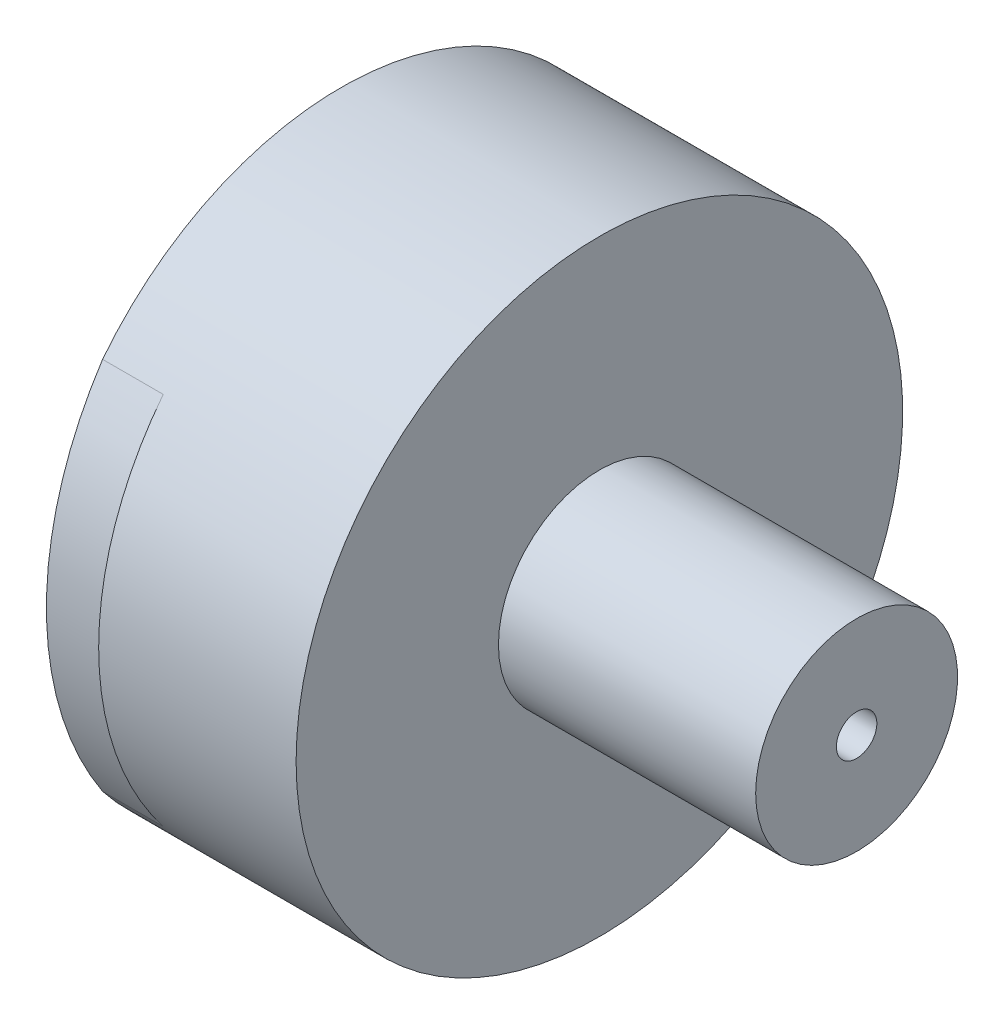
ISO-10303-21;
HEADER;
FILE_DESCRIPTION(('STEP AP214'),'2;1');
FILE_NAME('part.step','',(''),(''),'','','');
FILE_SCHEMA(('AUTOMOTIVE_DESIGN { 1 0 10303 214 1 1 1 1 }'));
ENDSEC;
DATA;
#1=APPLICATION_CONTEXT('core data for automotive mechanical design processes');
#2=APPLICATION_PROTOCOL_DEFINITION('international standard','automotive_design',2000,#1);
#3=PRODUCT_CONTEXT('',#1,'mechanical');
#4=PRODUCT('Part','Part','',(#3));
#5=PRODUCT_RELATED_PRODUCT_CATEGORY('part','',(#4));
#6=PRODUCT_DEFINITION_FORMATION('','',#4);
#7=PRODUCT_DEFINITION_CONTEXT('part definition',#1,'design');
#8=PRODUCT_DEFINITION('design','',#6,#7);
#9=PRODUCT_DEFINITION_SHAPE('','',#8);
#10=(LENGTH_UNIT() NAMED_UNIT(*) SI_UNIT(.MILLI.,.METRE.));
#11=(NAMED_UNIT(*) PLANE_ANGLE_UNIT() SI_UNIT($,.RADIAN.));
#12=(NAMED_UNIT(*) SI_UNIT($,.STERADIAN.) SOLID_ANGLE_UNIT());
#13=UNCERTAINTY_MEASURE_WITH_UNIT(LENGTH_MEASURE(1.E-05),#10,'distance_accuracy_value','');
#14=(GEOMETRIC_REPRESENTATION_CONTEXT(3) GLOBAL_UNCERTAINTY_ASSIGNED_CONTEXT((#13)) GLOBAL_UNIT_ASSIGNED_CONTEXT((#10,
#11,#12)) REPRESENTATION_CONTEXT('',''));
#15=CARTESIAN_POINT('',(0.,0.,0.));
#16=DIRECTION('',(0.,0.,1.));
#17=DIRECTION('',(1.,0.,0.));
#18=AXIS2_PLACEMENT_3D('',#15,#16,#17);
#19=CARTESIAN_POINT('',(11.5273434496704,0.,-2.00327059412866));
#20=DIRECTION('',(-1.,0.,0.));
#21=DIRECTION('',(0.,0.,1.));
#22=AXIS2_PLACEMENT_3D('',#19,#20,#21);
#23=CYLINDRICAL_SURFACE('',#22,0.249999999999999);
#24=CARTESIAN_POINT('',(11.5214103802107,0.,-2.00327059412866));
#25=DIRECTION('',(-1.,0.,0.));
#26=DIRECTION('',(0.,0.,1.));
#27=AXIS2_PLACEMENT_3D('',#24,#25,#26);
#28=CIRCLE('',#27,0.249999999999999);
#29=CARTESIAN_POINT('',(11.5214103802107,0.,-1.75327059412866));
#30=VERTEX_POINT('',#29);
#31=EDGE_CURVE('E94',#30,#30,#28,.T.);
#32=ORIENTED_EDGE('',*,*,#31,.F.);
#33=EDGE_LOOP('',(#32));
#34=FACE_BOUND('',#33,.T.);
#35=CARTESIAN_POINT('',(6.75,0.,-2.00327059412866));
#36=DIRECTION('',(-1.,0.,0.));
#37=DIRECTION('',(0.,0.,1.));
#38=AXIS2_PLACEMENT_3D('',#35,#36,#37);
#39=CIRCLE('',#38,0.249999999999999);
#40=CARTESIAN_POINT('',(6.75,0.,-1.75327059412866));
#41=VERTEX_POINT('',#40);
#42=EDGE_CURVE('E49',#41,#41,#39,.T.);
#43=ORIENTED_EDGE('',*,*,#42,.T.);
#44=EDGE_LOOP('',(#43));
#45=FACE_BOUND('',#44,.T.);
#46=ADVANCED_FACE('F45',(#34,#45),#23,.F.);
#47=CARTESIAN_POINT('',(5.15,1.5,0.));
#48=DIRECTION('',(1.,0.,0.));
#49=DIRECTION('',(0.,0.,-1.));
#50=AXIS2_PLACEMENT_3D('',#47,#48,#49);
#51=PLANE('',#50);
#52=CARTESIAN_POINT('',(5.15,0.,-2.00327059412866));
#53=DIRECTION('',(-1.,0.,0.));
#54=DIRECTION('',(0.,0.,1.));
#55=AXIS2_PLACEMENT_3D('',#52,#53,#54);
#56=CIRCLE('',#55,2.45);
#57=CARTESIAN_POINT('',(5.15,0.,0.446729405871341));
#58=VERTEX_POINT('',#57);
#59=EDGE_CURVE('E99',#58,#58,#56,.T.);
#60=ORIENTED_EDGE('',*,*,#59,.F.);
#61=EDGE_LOOP('',(#60));
#62=FACE_BOUND('',#61,.T.);
#63=CARTESIAN_POINT('',(5.15,0.,-2.00327059412866));
#64=DIRECTION('',(-1.,0.,0.));
#65=DIRECTION('',(0.,0.,1.));
#66=AXIS2_PLACEMENT_3D('',#63,#64,#65);
#67=CIRCLE('',#66,3.75);
#68=CARTESIAN_POINT('',(5.15,2.31316347355121,0.94830097786964));
#69=VERTEX_POINT('',#68);
#70=CARTESIAN_POINT('',(5.15,-2.31316347355121,0.948300977869641));
#71=VERTEX_POINT('',#70);
#72=EDGE_CURVE('E83',#69,#71,#67,.T.);
#73=ORIENTED_EDGE('',*,*,#72,.T.);
#74=CARTESIAN_POINT('',(5.15,0.,-2.55730521002783));
#75=DIRECTION('',(-1.,0.,0.));
#76=DIRECTION('',(0.,0.,-1.));
#77=AXIS2_PLACEMENT_3D('',#74,#75,#76);
#78=CIRCLE('',#77,4.19999999999959);
#79=EDGE_CURVE('E67',#71,#69,#78,.T.);
#80=ORIENTED_EDGE('',*,*,#79,.T.);
#81=EDGE_LOOP('',(#73,#80));
#82=FACE_BOUND('',#81,.T.);
#83=ADVANCED_FACE('F47',(#62,#82),#51,.F.);
#84=CARTESIAN_POINT('',(11.5273434496704,0.,-2.00327059412866));
#85=DIRECTION('',(-1.,0.,0.));
#86=DIRECTION('',(0.,0.,1.));
#87=AXIS2_PLACEMENT_3D('',#84,#85,#86);
#88=CYLINDRICAL_SURFACE('',#87,3.75);
#89=CARTESIAN_POINT('',(8.34104882918019,0.,-2.00327059412866));
#90=DIRECTION('',(-1.,0.,0.));
#91=DIRECTION('',(0.,0.,1.));
#92=AXIS2_PLACEMENT_3D('',#89,#90,#91);
#93=CIRCLE('',#92,3.75);
#94=CARTESIAN_POINT('',(8.34104882918019,0.,1.74672940587134));
#95=VERTEX_POINT('',#94);
#96=EDGE_CURVE('E77',#95,#95,#93,.T.);
#97=ORIENTED_EDGE('',*,*,#96,.T.);
#98=EDGE_LOOP('',(#97));
#99=FACE_BOUND('',#98,.T.);
#100=DIRECTION('',(-1.,0.,0.));
#101=VECTOR('',#100,1.);
#102=CARTESIAN_POINT('',(6.74552441459009,-2.31316347355121,0.94830097786964));
#103=LINE('',#102,#101);
#104=CARTESIAN_POINT('',(5.9,-2.31316347355121,0.94830097786964));
#105=VERTEX_POINT('',#104);
#106=EDGE_CURVE('E11',#71,#105,#103,.F.);
#107=ORIENTED_EDGE('',*,*,#106,.F.);
#108=ORIENTED_EDGE('',*,*,#72,.F.);
#109=DIRECTION('',(-1.,0.,0.));
#110=VECTOR('',#109,1.);
#111=CARTESIAN_POINT('',(6.74552441459009,2.31316347355121,0.94830097786964));
#112=LINE('',#111,#110);
#113=CARTESIAN_POINT('',(5.9,2.31316347355121,0.94830097786964));
#114=VERTEX_POINT('',#113);
#115=EDGE_CURVE('E54',#114,#69,#112,.T.);
#116=ORIENTED_EDGE('',*,*,#115,.F.);
#117=CARTESIAN_POINT('',(5.9,0.,-2.00327059412866));
#118=DIRECTION('',(-1.,0.,0.));
#119=DIRECTION('',(0.,0.,1.));
#120=AXIS2_PLACEMENT_3D('',#117,#118,#119);
#121=CIRCLE('',#120,3.75);
#122=EDGE_CURVE('E72',#105,#114,#121,.T.);
#123=ORIENTED_EDGE('',*,*,#122,.F.);
#124=EDGE_LOOP('',(#107,#108,#116,#123));
#125=FACE_BOUND('',#124,.T.);
#126=ADVANCED_FACE('F82',(#99,#125),#88,.T.);
#127=CARTESIAN_POINT('',(8.34104882918019,3.75,-2.00327059412866));
#128=DIRECTION('',(1.,0.,0.));
#129=DIRECTION('',(0.,0.,-1.));
#130=AXIS2_PLACEMENT_3D('',#127,#128,#129);
#131=PLANE('',#130);
#132=CARTESIAN_POINT('',(8.34104882918019,0.,-2.00327059412866));
#133=DIRECTION('',(-1.,0.,0.));
#134=DIRECTION('',(0.,0.,1.));
#135=AXIS2_PLACEMENT_3D('',#132,#133,#134);
#136=CIRCLE('',#135,1.24819439740606);
#137=CARTESIAN_POINT('',(8.34104882918019,0.,-0.755076196722596));
#138=VERTEX_POINT('',#137);
#139=EDGE_CURVE('E88',#138,#138,#136,.T.);
#140=ORIENTED_EDGE('',*,*,#139,.T.);
#141=EDGE_LOOP('',(#140));
#142=FACE_BOUND('',#141,.T.);
#143=ORIENTED_EDGE('',*,*,#96,.F.);
#144=EDGE_LOOP('',(#143));
#145=FACE_BOUND('',#144,.T.);
#146=ADVANCED_FACE('F138',(#142,#145),#131,.T.);
#147=CARTESIAN_POINT('',(11.5273434496704,0.,-2.00327059412866));
#148=DIRECTION('',(-1.,0.,0.));
#149=DIRECTION('',(0.,0.,1.));
#150=AXIS2_PLACEMENT_3D('',#147,#148,#149);
#151=CYLINDRICAL_SURFACE('',#150,1.24819439740606);
#152=CARTESIAN_POINT('',(11.5214103802107,0.,-2.00327059412866));
#153=DIRECTION('',(-1.,0.,0.));
#154=DIRECTION('',(0.,0.,1.));
#155=AXIS2_PLACEMENT_3D('',#152,#153,#154);
#156=CIRCLE('',#155,1.24819439740606);
#157=CARTESIAN_POINT('',(11.5214103802107,0.,-0.755076196722597));
#158=VERTEX_POINT('',#157);
#159=EDGE_CURVE('E91',#158,#158,#156,.T.);
#160=ORIENTED_EDGE('',*,*,#159,.T.);
#161=EDGE_LOOP('',(#160));
#162=FACE_BOUND('',#161,.T.);
#163=ORIENTED_EDGE('',*,*,#139,.F.);
#164=EDGE_LOOP('',(#163));
#165=FACE_BOUND('',#164,.T.);
#166=ADVANCED_FACE('F134',(#162,#165),#151,.T.);
#167=CARTESIAN_POINT('',(11.5214103802107,1.24819439740606,-2.00327059412866));
#168=DIRECTION('',(1.,0.,0.));
#169=DIRECTION('',(0.,0.,-1.));
#170=AXIS2_PLACEMENT_3D('',#167,#168,#169);
#171=PLANE('',#170);
#172=ORIENTED_EDGE('',*,*,#31,.T.);
#173=EDGE_LOOP('',(#172));
#174=FACE_BOUND('',#173,.T.);
#175=ORIENTED_EDGE('',*,*,#159,.F.);
#176=EDGE_LOOP('',(#175));
#177=FACE_BOUND('',#176,.T.);
#178=ADVANCED_FACE('F131',(#174,#177),#171,.T.);
#179=CARTESIAN_POINT('',(5.15,0.,-2.55730521002783));
#180=DIRECTION('',(1.,0.,0.));
#181=DIRECTION('',(0.,0.,-1.));
#182=AXIS2_PLACEMENT_3D('',#179,#180,#181);
#183=CYLINDRICAL_SURFACE('',#182,4.19999999999959);
#184=CARTESIAN_POINT('',(5.9,0.,-2.55730521002783));
#185=DIRECTION('',(-1.,0.,0.));
#186=DIRECTION('',(0.,0.,-1.));
#187=AXIS2_PLACEMENT_3D('',#184,#185,#186);
#188=CIRCLE('',#187,4.19999999999959);
#189=EDGE_CURVE('E60',#105,#114,#188,.T.);
#190=ORIENTED_EDGE('',*,*,#189,.T.);
#191=ORIENTED_EDGE('',*,*,#115,.T.);
#192=ORIENTED_EDGE('',*,*,#79,.F.);
#193=ORIENTED_EDGE('',*,*,#106,.T.);
#194=EDGE_LOOP('',(#190,#191,#192,#193));
#195=FACE_BOUND('',#194,.T.);
#196=ADVANCED_FACE('F79',(#195),#183,.T.);
#197=CARTESIAN_POINT('',(5.9,0.,-1.27865260501392));
#198=DIRECTION('',(1.,0.,0.));
#199=DIRECTION('',(0.,0.,-1.));
#200=AXIS2_PLACEMENT_3D('',#197,#198,#199);
#201=PLANE('',#200);
#202=ORIENTED_EDGE('',*,*,#122,.T.);
#203=ORIENTED_EDGE('',*,*,#189,.F.);
#204=EDGE_LOOP('',(#202,#203));
#205=FACE_BOUND('',#204,.T.);
#206=ADVANCED_FACE('F73',(#205),#201,.F.);
#207=CARTESIAN_POINT('',(6.75,0.,-2.00327059412866));
#208=DIRECTION('',(-1.,0.,0.));
#209=DIRECTION('',(0.,0.,1.));
#210=AXIS2_PLACEMENT_3D('',#207,#208,#209);
#211=CYLINDRICAL_SURFACE('',#210,2.45);
#212=CARTESIAN_POINT('',(6.75,0.,-2.00327059412866));
#213=DIRECTION('',(-1.,0.,0.));
#214=DIRECTION('',(0.,0.,1.));
#215=AXIS2_PLACEMENT_3D('',#212,#213,#214);
#216=CIRCLE('',#215,2.45);
#217=CARTESIAN_POINT('',(6.75,0.,0.446729405871341));
#218=VERTEX_POINT('',#217);
#219=EDGE_CURVE('E102',#218,#218,#216,.T.);
#220=ORIENTED_EDGE('',*,*,#219,.F.);
#221=EDGE_LOOP('',(#220));
#222=FACE_BOUND('',#221,.T.);
#223=ORIENTED_EDGE('',*,*,#59,.T.);
#224=EDGE_LOOP('',(#223));
#225=FACE_BOUND('',#224,.T.);
#226=ADVANCED_FACE('F112',(#222,#225),#211,.F.);
#227=CARTESIAN_POINT('',(6.75,0.,-2.00327059412866));
#228=DIRECTION('',(-1.,0.,0.));
#229=DIRECTION('',(0.,0.,1.));
#230=AXIS2_PLACEMENT_3D('',#227,#228,#229);
#231=PLANE('',#230);
#232=ORIENTED_EDGE('',*,*,#42,.F.);
#233=EDGE_LOOP('',(#232));
#234=FACE_BOUND('',#233,.T.);
#235=ORIENTED_EDGE('',*,*,#219,.T.);
#236=EDGE_LOOP('',(#235));
#237=FACE_BOUND('',#236,.T.);
#238=ADVANCED_FACE('F110',(#234,#237),#231,.T.);
#239=CLOSED_SHELL('',(#46,#83,#126,#146,#166,#178,#196,#206,#226,#238));
#240=MANIFOLD_SOLID_BREP('B2',#239);
#241=ADVANCED_BREP_SHAPE_REPRESENTATION('',(#18,#240),#14);
#242=SHAPE_DEFINITION_REPRESENTATION(#9,#241);
ENDSEC;
END-ISO-10303-21;
